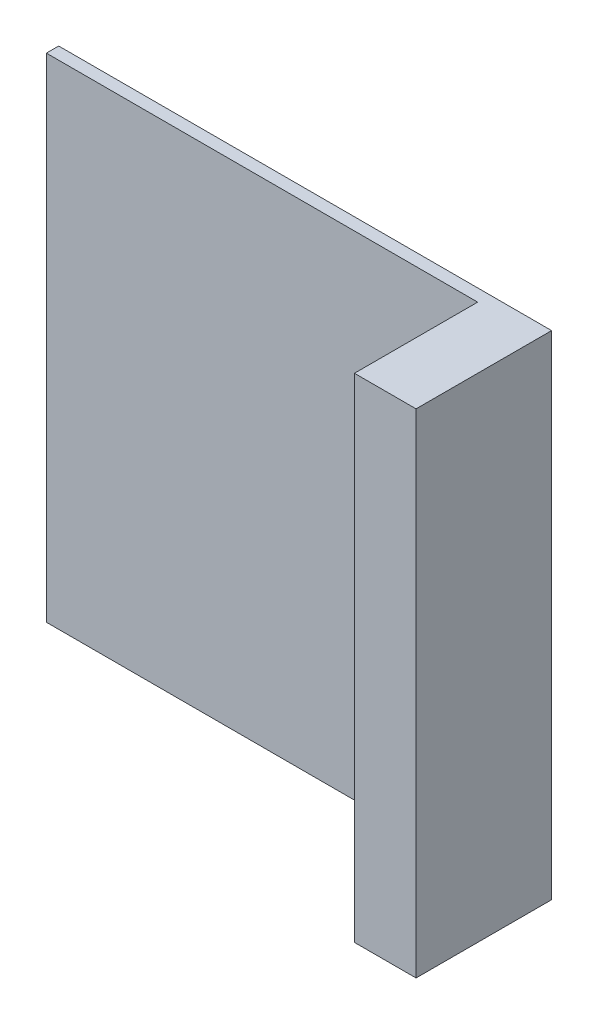
ISO-10303-21;
HEADER;
FILE_DESCRIPTION(('STEP AP214'),'2;1');
FILE_NAME('part.step','',(''),(''),'','','');
FILE_SCHEMA(('AUTOMOTIVE_DESIGN { 1 0 10303 214 1 1 1 1 }'));
ENDSEC;
DATA;
#1=APPLICATION_CONTEXT('core data for automotive mechanical design processes');
#2=APPLICATION_PROTOCOL_DEFINITION('international standard','automotive_design',2000,#1);
#3=PRODUCT_CONTEXT('',#1,'mechanical');
#4=PRODUCT('Part','Part','',(#3));
#5=PRODUCT_RELATED_PRODUCT_CATEGORY('part','',(#4));
#6=PRODUCT_DEFINITION_FORMATION('','',#4);
#7=PRODUCT_DEFINITION_CONTEXT('part definition',#1,'design');
#8=PRODUCT_DEFINITION('design','',#6,#7);
#9=PRODUCT_DEFINITION_SHAPE('','',#8);
#10=(LENGTH_UNIT() NAMED_UNIT(*) SI_UNIT(.MILLI.,.METRE.));
#11=(NAMED_UNIT(*) PLANE_ANGLE_UNIT() SI_UNIT($,.RADIAN.));
#12=(NAMED_UNIT(*) SI_UNIT($,.STERADIAN.) SOLID_ANGLE_UNIT());
#13=UNCERTAINTY_MEASURE_WITH_UNIT(LENGTH_MEASURE(1.E-05),#10,'distance_accuracy_value','');
#14=(GEOMETRIC_REPRESENTATION_CONTEXT(3) GLOBAL_UNCERTAINTY_ASSIGNED_CONTEXT((#13)) GLOBAL_UNIT_ASSIGNED_CONTEXT((#10,
#11,#12)) REPRESENTATION_CONTEXT('',''));
#15=CARTESIAN_POINT('',(0.,0.,0.));
#16=DIRECTION('',(0.,0.,1.));
#17=DIRECTION('',(1.,0.,0.));
#18=AXIS2_PLACEMENT_3D('',#15,#16,#17);
#19=CARTESIAN_POINT('',(-68.9470327141213,368.599704093375,10.));
#20=DIRECTION('',(1.,0.,0.));
#21=DIRECTION('',(0.,1.,0.));
#22=AXIS2_PLACEMENT_3D('',#19,#20,#21);
#23=PLANE('',#22);
#24=DIRECTION('',(0.,-1.,0.));
#25=VECTOR('',#24,1.);
#26=CARTESIAN_POINT('',(-68.9470327141213,368.599704093375,0.));
#27=LINE('',#26,#25);
#28=CARTESIAN_POINT('',(-68.9470327141213,368.599704093375,0.));
#29=VERTEX_POINT('',#28);
#30=CARTESIAN_POINT('',(-68.9470327141213,-31.400295906625,0.));
#31=VERTEX_POINT('',#30);
#32=EDGE_CURVE('E89',#29,#31,#27,.T.);
#33=ORIENTED_EDGE('',*,*,#32,.T.);
#34=DIRECTION('',(0.,0.,-1.));
#35=VECTOR('',#34,1.);
#36=CARTESIAN_POINT('',(-68.9470327141213,-31.400295906625,10.));
#37=LINE('',#36,#35);
#38=CARTESIAN_POINT('',(-68.9470327141213,-31.400295906625,10.));
#39=VERTEX_POINT('',#38);
#40=EDGE_CURVE('E11',#39,#31,#37,.T.);
#41=ORIENTED_EDGE('',*,*,#40,.F.);
#42=DIRECTION('',(0.,-1.,0.));
#43=VECTOR('',#42,1.);
#44=CARTESIAN_POINT('',(-68.9470327141213,368.599704093375,10.));
#45=LINE('',#44,#43);
#46=CARTESIAN_POINT('',(-68.9470327141213,368.599704093375,10.));
#47=VERTEX_POINT('',#46);
#48=EDGE_CURVE('E83',#47,#39,#45,.T.);
#49=ORIENTED_EDGE('',*,*,#48,.F.);
#50=DIRECTION('',(0.,0.,-1.));
#51=VECTOR('',#50,1.);
#52=CARTESIAN_POINT('',(-68.9470327141213,368.599704093375,10.));
#53=LINE('',#52,#51);
#54=EDGE_CURVE('E75',#47,#29,#53,.T.);
#55=ORIENTED_EDGE('',*,*,#54,.T.);
#56=EDGE_LOOP('',(#33,#41,#49,#55));
#57=FACE_BOUND('',#56,.T.);
#58=ADVANCED_FACE('F33',(#57),#23,.F.);
#59=CARTESIAN_POINT('',(-68.9470327141213,-31.400295906625,10.));
#60=DIRECTION('',(0.,1.,0.));
#61=DIRECTION('',(0.,0.,1.));
#62=AXIS2_PLACEMENT_3D('',#59,#60,#61);
#63=PLANE('',#62);
#64=DIRECTION('',(1.,0.,0.));
#65=VECTOR('',#64,1.);
#66=CARTESIAN_POINT('',(-68.9470327141213,-31.400295906625,0.));
#67=LINE('',#66,#65);
#68=CARTESIAN_POINT('',(331.052967285879,-31.400295906625,0.));
#69=VERTEX_POINT('',#68);
#70=EDGE_CURVE('E92',#31,#69,#67,.T.);
#71=ORIENTED_EDGE('',*,*,#70,.T.);
#72=DIRECTION('',(0.,0.,-1.));
#73=VECTOR('',#72,1.);
#74=CARTESIAN_POINT('',(331.052967285879,-31.400295906625,10.));
#75=LINE('',#74,#73);
#76=CARTESIAN_POINT('',(331.052967285879,-31.400295906625,110.));
#77=VERTEX_POINT('',#76);
#78=EDGE_CURVE('E40',#77,#69,#75,.T.);
#79=ORIENTED_EDGE('',*,*,#78,.F.);
#80=DIRECTION('',(1.,0.,0.));
#81=VECTOR('',#80,1.);
#82=CARTESIAN_POINT('',(331.052967285879,-31.400295906625,110.));
#83=LINE('',#82,#81);
#84=CARTESIAN_POINT('',(281.052967285879,-31.400295906625,110.));
#85=VERTEX_POINT('',#84);
#86=EDGE_CURVE('E116',#85,#77,#83,.T.);
#87=ORIENTED_EDGE('',*,*,#86,.F.);
#88=DIRECTION('',(0.,0.,-1.));
#89=VECTOR('',#88,1.);
#90=CARTESIAN_POINT('',(281.052967285879,-31.400295906625,110.));
#91=LINE('',#90,#89);
#92=CARTESIAN_POINT('',(281.052967285879,-31.400295906625,10.));
#93=VERTEX_POINT('',#92);
#94=EDGE_CURVE('E97',#85,#93,#91,.T.);
#95=ORIENTED_EDGE('',*,*,#94,.T.);
#96=DIRECTION('',(1.,0.,0.));
#97=VECTOR('',#96,1.);
#98=CARTESIAN_POINT('',(-68.9470327141213,-31.400295906625,10.));
#99=LINE('',#98,#97);
#100=EDGE_CURVE('E133',#39,#93,#99,.T.);
#101=ORIENTED_EDGE('',*,*,#100,.F.);
#102=ORIENTED_EDGE('',*,*,#40,.T.);
#103=EDGE_LOOP('',(#71,#79,#87,#95,#101,#102));
#104=FACE_BOUND('',#103,.T.);
#105=ADVANCED_FACE('F113',(#104),#63,.F.);
#106=CARTESIAN_POINT('',(331.052967285879,368.599704093375,10.));
#107=DIRECTION('',(-1.,0.,0.));
#108=DIRECTION('',(0.,-1.,0.));
#109=AXIS2_PLACEMENT_3D('',#106,#107,#108);
#110=PLANE('',#109);
#111=DIRECTION('',(0.,1.,0.));
#112=VECTOR('',#111,1.);
#113=CARTESIAN_POINT('',(331.052967285879,368.599704093375,0.));
#114=LINE('',#113,#112);
#115=CARTESIAN_POINT('',(331.052967285879,368.599704093375,0.));
#116=VERTEX_POINT('',#115);
#117=EDGE_CURVE('E84',#69,#116,#114,.T.);
#118=ORIENTED_EDGE('',*,*,#117,.T.);
#119=DIRECTION('',(0.,0.,-1.));
#120=VECTOR('',#119,1.);
#121=CARTESIAN_POINT('',(331.052967285879,368.599704093375,10.));
#122=LINE('',#121,#120);
#123=CARTESIAN_POINT('',(331.052967285879,368.599704093375,110.));
#124=VERTEX_POINT('',#123);
#125=EDGE_CURVE('E79',#124,#116,#122,.T.);
#126=ORIENTED_EDGE('',*,*,#125,.F.);
#127=DIRECTION('',(0.,1.,0.));
#128=VECTOR('',#127,1.);
#129=CARTESIAN_POINT('',(331.052967285879,368.599704093375,110.));
#130=LINE('',#129,#128);
#131=EDGE_CURVE('E109',#77,#124,#130,.T.);
#132=ORIENTED_EDGE('',*,*,#131,.F.);
#133=ORIENTED_EDGE('',*,*,#78,.T.);
#134=EDGE_LOOP('',(#118,#126,#132,#133));
#135=FACE_BOUND('',#134,.T.);
#136=ADVANCED_FACE('F107',(#135),#110,.F.);
#137=CARTESIAN_POINT('',(-68.9470327141213,368.599704093375,10.));
#138=DIRECTION('',(0.,-1.,0.));
#139=DIRECTION('',(0.,0.,-1.));
#140=AXIS2_PLACEMENT_3D('',#137,#138,#139);
#141=PLANE('',#140);
#142=DIRECTION('',(-1.,0.,0.));
#143=VECTOR('',#142,1.);
#144=CARTESIAN_POINT('',(-68.9470327141213,368.599704093375,0.));
#145=LINE('',#144,#143);
#146=EDGE_CURVE('E72',#116,#29,#145,.T.);
#147=ORIENTED_EDGE('',*,*,#146,.T.);
#148=ORIENTED_EDGE('',*,*,#54,.F.);
#149=DIRECTION('',(-1.,0.,0.));
#150=VECTOR('',#149,1.);
#151=CARTESIAN_POINT('',(-68.9470327141213,368.599704093375,10.));
#152=LINE('',#151,#150);
#153=CARTESIAN_POINT('',(281.052967285879,368.599704093375,10.));
#154=VERTEX_POINT('',#153);
#155=EDGE_CURVE('E52',#154,#47,#152,.T.);
#156=ORIENTED_EDGE('',*,*,#155,.F.);
#157=DIRECTION('',(0.,0.,-1.));
#158=VECTOR('',#157,1.);
#159=CARTESIAN_POINT('',(281.052967285879,368.599704093375,110.));
#160=LINE('',#159,#158);
#161=CARTESIAN_POINT('',(281.052967285879,368.599704093375,110.));
#162=VERTEX_POINT('',#161);
#163=EDGE_CURVE('E93',#162,#154,#160,.T.);
#164=ORIENTED_EDGE('',*,*,#163,.F.);
#165=DIRECTION('',(-1.,0.,0.));
#166=VECTOR('',#165,1.);
#167=CARTESIAN_POINT('',(331.052967285879,368.599704093375,110.));
#168=LINE('',#167,#166);
#169=EDGE_CURVE('E128',#124,#162,#168,.T.);
#170=ORIENTED_EDGE('',*,*,#169,.F.);
#171=ORIENTED_EDGE('',*,*,#125,.T.);
#172=EDGE_LOOP('',(#147,#148,#156,#164,#170,#171));
#173=FACE_BOUND('',#172,.T.);
#174=ADVANCED_FACE('F74',(#173),#141,.F.);
#175=CARTESIAN_POINT('',(0.,0.,10.));
#176=DIRECTION('',(0.,0.,1.));
#177=DIRECTION('',(1.,0.,0.));
#178=AXIS2_PLACEMENT_3D('',#175,#176,#177);
#179=PLANE('',#178);
#180=DIRECTION('',(0.,-1.,0.));
#181=VECTOR('',#180,1.);
#182=CARTESIAN_POINT('',(281.052967285879,368.599704093375,10.));
#183=LINE('',#182,#181);
#184=EDGE_CURVE('E47',#154,#93,#183,.T.);
#185=ORIENTED_EDGE('',*,*,#184,.F.);
#186=ORIENTED_EDGE('',*,*,#155,.T.);
#187=ORIENTED_EDGE('',*,*,#48,.T.);
#188=ORIENTED_EDGE('',*,*,#100,.T.);
#189=EDGE_LOOP('',(#185,#186,#187,#188));
#190=FACE_BOUND('',#189,.T.);
#191=ADVANCED_FACE('F135',(#190),#179,.T.);
#192=CARTESIAN_POINT('',(0.,0.,0.));
#193=DIRECTION('',(0.,0.,1.));
#194=DIRECTION('',(1.,0.,0.));
#195=AXIS2_PLACEMENT_3D('',#192,#193,#194);
#196=PLANE('',#195);
#197=ORIENTED_EDGE('',*,*,#32,.F.);
#198=ORIENTED_EDGE('',*,*,#146,.F.);
#199=ORIENTED_EDGE('',*,*,#117,.F.);
#200=ORIENTED_EDGE('',*,*,#70,.F.);
#201=EDGE_LOOP('',(#197,#198,#199,#200));
#202=FACE_BOUND('',#201,.T.);
#203=ADVANCED_FACE('F91',(#202),#196,.F.);
#204=CARTESIAN_POINT('',(281.052967285879,368.599704093375,110.));
#205=DIRECTION('',(1.,0.,0.));
#206=DIRECTION('',(0.,1.,0.));
#207=AXIS2_PLACEMENT_3D('',#204,#205,#206);
#208=PLANE('',#207);
#209=ORIENTED_EDGE('',*,*,#184,.T.);
#210=ORIENTED_EDGE('',*,*,#94,.F.);
#211=DIRECTION('',(0.,-1.,0.));
#212=VECTOR('',#211,1.);
#213=CARTESIAN_POINT('',(281.052967285879,368.599704093375,110.));
#214=LINE('',#213,#212);
#215=EDGE_CURVE('E124',#162,#85,#214,.T.);
#216=ORIENTED_EDGE('',*,*,#215,.F.);
#217=ORIENTED_EDGE('',*,*,#163,.T.);
#218=EDGE_LOOP('',(#209,#210,#216,#217));
#219=FACE_BOUND('',#218,.T.);
#220=ADVANCED_FACE('F137',(#219),#208,.F.);
#221=CARTESIAN_POINT('',(0.,0.,110.));
#222=DIRECTION('',(0.,0.,-1.));
#223=DIRECTION('',(-1.,0.,0.));
#224=AXIS2_PLACEMENT_3D('',#221,#222,#223);
#225=PLANE('',#224);
#226=ORIENTED_EDGE('',*,*,#131,.T.);
#227=ORIENTED_EDGE('',*,*,#169,.T.);
#228=ORIENTED_EDGE('',*,*,#215,.T.);
#229=ORIENTED_EDGE('',*,*,#86,.T.);
#230=EDGE_LOOP('',(#226,#227,#228,#229));
#231=FACE_BOUND('',#230,.T.);
#232=ADVANCED_FACE('F120',(#231),#225,.F.);
#233=CLOSED_SHELL('',(#58,#105,#136,#174,#191,#203,#220,#232));
#234=MANIFOLD_SOLID_BREP('B2',#233);
#235=ADVANCED_BREP_SHAPE_REPRESENTATION('',(#18,#234),#14);
#236=SHAPE_DEFINITION_REPRESENTATION(#9,#235);
ENDSEC;
END-ISO-10303-21;
